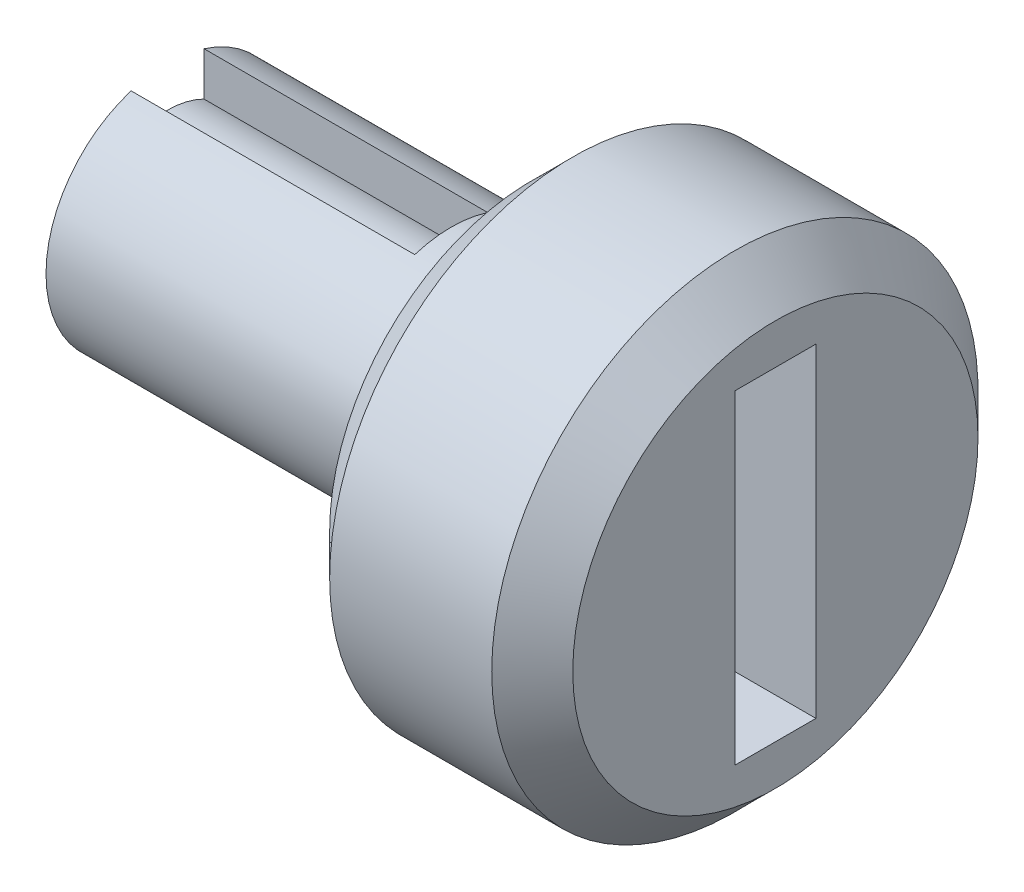
ISO-10303-21;
HEADER;
FILE_DESCRIPTION(('STEP AP214'),'2;1');
FILE_NAME('part.step','',(''),(''),'','','');
FILE_SCHEMA(('AUTOMOTIVE_DESIGN { 1 0 10303 214 1 1 1 1 }'));
ENDSEC;
DATA;
#1=APPLICATION_CONTEXT('core data for automotive mechanical design processes');
#2=APPLICATION_PROTOCOL_DEFINITION('international standard','automotive_design',2000,#1);
#3=PRODUCT_CONTEXT('',#1,'mechanical');
#4=PRODUCT('Part','Part','',(#3));
#5=PRODUCT_RELATED_PRODUCT_CATEGORY('part','',(#4));
#6=PRODUCT_DEFINITION_FORMATION('','',#4);
#7=PRODUCT_DEFINITION_CONTEXT('part definition',#1,'design');
#8=PRODUCT_DEFINITION('design','',#6,#7);
#9=PRODUCT_DEFINITION_SHAPE('','',#8);
#10=(LENGTH_UNIT() NAMED_UNIT(*) SI_UNIT(.MILLI.,.METRE.));
#11=(NAMED_UNIT(*) PLANE_ANGLE_UNIT() SI_UNIT($,.RADIAN.));
#12=(NAMED_UNIT(*) SI_UNIT($,.STERADIAN.) SOLID_ANGLE_UNIT());
#13=UNCERTAINTY_MEASURE_WITH_UNIT(LENGTH_MEASURE(1.E-05),#10,'distance_accuracy_value','');
#14=(GEOMETRIC_REPRESENTATION_CONTEXT(3) GLOBAL_UNCERTAINTY_ASSIGNED_CONTEXT((#13)) GLOBAL_UNIT_ASSIGNED_CONTEXT((#10,
#11,#12)) REPRESENTATION_CONTEXT('',''));
#15=CARTESIAN_POINT('',(0.,0.,0.));
#16=DIRECTION('',(0.,0.,1.));
#17=DIRECTION('',(1.,0.,0.));
#18=AXIS2_PLACEMENT_3D('',#15,#16,#17);
#19=CARTESIAN_POINT('',(0.,0.,0.));
#20=DIRECTION('',(1.,0.,0.));
#21=DIRECTION('',(0.,0.,-1.));
#22=AXIS2_PLACEMENT_3D('',#19,#20,#21);
#23=PLANE('',#22);
#24=CARTESIAN_POINT('',(0.,0.,0.));
#25=DIRECTION('',(-1.,0.,0.));
#26=DIRECTION('',(0.,0.,1.));
#27=AXIS2_PLACEMENT_3D('',#24,#25,#26);
#28=CIRCLE('',#27,1.2);
#29=CARTESIAN_POINT('',(0.,0.,1.2));
#30=VERTEX_POINT('',#29);
#31=EDGE_CURVE('E216',#30,#30,#28,.T.);
#32=ORIENTED_EDGE('',*,*,#31,.F.);
#33=EDGE_LOOP('',(#32));
#34=FACE_BOUND('',#33,.T.);
#35=CARTESIAN_POINT('',(0.,0.,0.));
#36=DIRECTION('',(1.,0.,0.));
#37=DIRECTION('',(0.,0.,1.));
#38=AXIS2_PLACEMENT_3D('',#35,#36,#37);
#39=CIRCLE('',#38,2.);
#40=CARTESIAN_POINT('',(0.,-1.78605710994917,0.9));
#41=VERTEX_POINT('',#40);
#42=CARTESIAN_POINT('',(0.,-1.78605710994917,-0.9));
#43=VERTEX_POINT('',#42);
#44=EDGE_CURVE('E148',#41,#43,#39,.T.);
#45=ORIENTED_EDGE('',*,*,#44,.F.);
#46=DIRECTION('',(0.,1.,0.));
#47=VECTOR('',#46,1.);
#48=CARTESIAN_POINT('',(0.,-1.78605710994917,0.9));
#49=LINE('',#48,#47);
#50=CARTESIAN_POINT('',(0.,-2.86181760425084,0.9));
#51=VERTEX_POINT('',#50);
#52=EDGE_CURVE('E140',#51,#41,#49,.T.);
#53=ORIENTED_EDGE('',*,*,#52,.F.);
#54=CARTESIAN_POINT('',(0.,0.,0.));
#55=DIRECTION('',(-1.,0.,0.));
#56=DIRECTION('',(0.,0.,1.));
#57=AXIS2_PLACEMENT_3D('',#54,#55,#56);
#58=CIRCLE('',#57,3.);
#59=CARTESIAN_POINT('',(0.,2.86181760425084,0.9));
#60=VERTEX_POINT('',#59);
#61=EDGE_CURVE('E57',#51,#60,#58,.T.);
#62=ORIENTED_EDGE('',*,*,#61,.T.);
#63=DIRECTION('',(0.,1.,0.));
#64=VECTOR('',#63,1.);
#65=CARTESIAN_POINT('',(0.,2.86181760425084,0.9));
#66=LINE('',#65,#64);
#67=CARTESIAN_POINT('',(0.,1.78605710994917,0.9));
#68=VERTEX_POINT('',#67);
#69=EDGE_CURVE('E162',#68,#60,#66,.T.);
#70=ORIENTED_EDGE('',*,*,#69,.F.);
#71=CARTESIAN_POINT('',(0.,0.,0.));
#72=DIRECTION('',(1.,0.,0.));
#73=DIRECTION('',(0.,0.,1.));
#74=AXIS2_PLACEMENT_3D('',#71,#72,#73);
#75=CIRCLE('',#74,2.);
#76=CARTESIAN_POINT('',(0.,1.78605710994917,-0.9));
#77=VERTEX_POINT('',#76);
#78=EDGE_CURVE('E165',#77,#68,#75,.T.);
#79=ORIENTED_EDGE('',*,*,#78,.F.);
#80=DIRECTION('',(0.,-1.,0.));
#81=VECTOR('',#80,1.);
#82=CARTESIAN_POINT('',(0.,2.86181760425084,-0.9));
#83=LINE('',#82,#81);
#84=CARTESIAN_POINT('',(0.,2.86181760425084,-0.9));
#85=VERTEX_POINT('',#84);
#86=EDGE_CURVE('E161',#85,#77,#83,.T.);
#87=ORIENTED_EDGE('',*,*,#86,.F.);
#88=CARTESIAN_POINT('',(0.,-2.86181760425084,-0.9));
#89=VERTEX_POINT('',#88);
#90=EDGE_CURVE('E231',#85,#89,#58,.T.);
#91=ORIENTED_EDGE('',*,*,#90,.T.);
#92=DIRECTION('',(0.,-1.,0.));
#93=VECTOR('',#92,1.);
#94=CARTESIAN_POINT('',(0.,-1.78605710994917,-0.9));
#95=LINE('',#94,#93);
#96=EDGE_CURVE('E49',#43,#89,#95,.T.);
#97=ORIENTED_EDGE('',*,*,#96,.F.);
#98=EDGE_LOOP('',(#45,#53,#62,#70,#79,#87,#91,#97));
#99=FACE_BOUND('',#98,.T.);
#100=ADVANCED_FACE('F34',(#34,#99),#23,.F.);
#101=CARTESIAN_POINT('',(0.,0.,0.));
#102=DIRECTION('',(-1.,0.,0.));
#103=DIRECTION('',(0.,0.,1.));
#104=AXIS2_PLACEMENT_3D('',#101,#102,#103);
#105=CYLINDRICAL_SURFACE('',#104,3.);
#106=ORIENTED_EDGE('',*,*,#61,.F.);
#107=DIRECTION('',(-1.,0.,0.));
#108=VECTOR('',#107,1.);
#109=CARTESIAN_POINT('',(11.171095884641,-2.86181760425084,0.9));
#110=LINE('',#109,#108);
#111=CARTESIAN_POINT('',(7.,-2.86181760425084,0.9));
#112=VERTEX_POINT('',#111);
#113=EDGE_CURVE('E154',#112,#51,#110,.T.);
#114=ORIENTED_EDGE('',*,*,#113,.F.);
#115=CARTESIAN_POINT('',(7.,0.,0.));
#116=DIRECTION('',(1.,0.,0.));
#117=DIRECTION('',(0.,0.,-1.));
#118=AXIS2_PLACEMENT_3D('',#115,#116,#117);
#119=CIRCLE('',#118,3.);
#120=CARTESIAN_POINT('',(7.,-2.86181760425084,-0.9));
#121=VERTEX_POINT('',#120);
#122=EDGE_CURVE('E145',#121,#112,#119,.F.);
#123=ORIENTED_EDGE('',*,*,#122,.F.);
#124=DIRECTION('',(-1.,0.,0.));
#125=VECTOR('',#124,1.);
#126=CARTESIAN_POINT('',(11.171095884641,-2.86181760425084,-0.9));
#127=LINE('',#126,#125);
#128=EDGE_CURVE('E155',#121,#89,#127,.T.);
#129=ORIENTED_EDGE('',*,*,#128,.T.);
#130=ORIENTED_EDGE('',*,*,#90,.F.);
#131=DIRECTION('',(-1.,0.,0.));
#132=VECTOR('',#131,1.);
#133=CARTESIAN_POINT('',(11.171095884641,2.86181760425084,-0.9));
#134=LINE('',#133,#132);
#135=CARTESIAN_POINT('',(7.,2.86181760425084,-0.9));
#136=VERTEX_POINT('',#135);
#137=EDGE_CURVE('E176',#136,#85,#134,.T.);
#138=ORIENTED_EDGE('',*,*,#137,.F.);
#139=CARTESIAN_POINT('',(7.,0.,0.));
#140=DIRECTION('',(1.,0.,0.));
#141=DIRECTION('',(0.,0.,-1.));
#142=AXIS2_PLACEMENT_3D('',#139,#140,#141);
#143=CIRCLE('',#142,3.);
#144=CARTESIAN_POINT('',(7.,2.86181760425084,0.9));
#145=VERTEX_POINT('',#144);
#146=EDGE_CURVE('E173',#145,#136,#143,.F.);
#147=ORIENTED_EDGE('',*,*,#146,.F.);
#148=DIRECTION('',(-1.,0.,0.));
#149=VECTOR('',#148,1.);
#150=CARTESIAN_POINT('',(11.171095884641,2.86181760425084,0.9));
#151=LINE('',#150,#149);
#152=EDGE_CURVE('E177',#145,#60,#151,.T.);
#153=ORIENTED_EDGE('',*,*,#152,.T.);
#154=EDGE_LOOP('',(#106,#114,#123,#129,#130,#138,#147,#153));
#155=FACE_BOUND('',#154,.T.);
#156=CARTESIAN_POINT('',(9.,0.,0.));
#157=DIRECTION('',(-1.,0.,0.));
#158=DIRECTION('',(0.,0.,1.));
#159=AXIS2_PLACEMENT_3D('',#156,#157,#158);
#160=CIRCLE('',#159,3.);
#161=CARTESIAN_POINT('',(9.,0.,3.));
#162=VERTEX_POINT('',#161);
#163=EDGE_CURVE('E228',#162,#162,#160,.T.);
#164=ORIENTED_EDGE('',*,*,#163,.T.);
#165=EDGE_LOOP('',(#164));
#166=FACE_BOUND('',#165,.T.);
#167=ADVANCED_FACE('F265',(#155,#166),#105,.T.);
#168=CARTESIAN_POINT('',(9.,0.,-3.));
#169=DIRECTION('',(1.,0.,0.));
#170=DIRECTION('',(0.,0.,-1.));
#171=AXIS2_PLACEMENT_3D('',#168,#169,#170);
#172=PLANE('',#171);
#173=CARTESIAN_POINT('',(9.,0.,0.));
#174=DIRECTION('',(1.,0.,0.));
#175=DIRECTION('',(0.,0.,-1.));
#176=AXIS2_PLACEMENT_3D('',#173,#174,#175);
#177=CIRCLE('',#176,4.99999999999999);
#178=CARTESIAN_POINT('',(9.,0.,-4.99999999999999));
#179=VERTEX_POINT('',#178);
#180=EDGE_CURVE('E13',#179,#179,#177,.F.);
#181=ORIENTED_EDGE('',*,*,#180,.T.);
#182=EDGE_LOOP('',(#181));
#183=FACE_BOUND('',#182,.T.);
#184=ORIENTED_EDGE('',*,*,#163,.F.);
#185=EDGE_LOOP('',(#184));
#186=FACE_BOUND('',#185,.T.);
#187=ADVANCED_FACE('F254',(#183,#186),#172,.F.);
#188=CARTESIAN_POINT('',(0.,0.,0.));
#189=DIRECTION('',(-1.,0.,0.));
#190=DIRECTION('',(0.,0.,1.));
#191=AXIS2_PLACEMENT_3D('',#188,#189,#190);
#192=CYLINDRICAL_SURFACE('',#191,6.);
#193=CARTESIAN_POINT('',(14.,0.,0.));
#194=DIRECTION('',(-1.,0.,0.));
#195=DIRECTION('',(0.,0.,1.));
#196=AXIS2_PLACEMENT_3D('',#193,#194,#195);
#197=CIRCLE('',#196,6.);
#198=CARTESIAN_POINT('',(14.,0.,6.));
#199=VERTEX_POINT('',#198);
#200=EDGE_CURVE('E237',#199,#199,#197,.T.);
#201=ORIENTED_EDGE('',*,*,#200,.T.);
#202=EDGE_LOOP('',(#201));
#203=FACE_BOUND('',#202,.T.);
#204=CARTESIAN_POINT('',(10.,0.,0.));
#205=DIRECTION('',(1.,0.,0.));
#206=DIRECTION('',(0.,0.,-1.));
#207=AXIS2_PLACEMENT_3D('',#204,#205,#206);
#208=CIRCLE('',#207,6.);
#209=CARTESIAN_POINT('',(10.,0.,-6.));
#210=VERTEX_POINT('',#209);
#211=EDGE_CURVE('E234',#210,#210,#208,.T.);
#212=ORIENTED_EDGE('',*,*,#211,.T.);
#213=EDGE_LOOP('',(#212));
#214=FACE_BOUND('',#213,.T.);
#215=ADVANCED_FACE('F251',(#203,#214),#192,.T.);
#216=CARTESIAN_POINT('',(15.,0.,-6.));
#217=DIRECTION('',(-1.,0.,0.));
#218=DIRECTION('',(0.,0.,1.));
#219=AXIS2_PLACEMENT_3D('',#216,#217,#218);
#220=PLANE('',#219);
#221=CARTESIAN_POINT('',(15.,0.,0.));
#222=DIRECTION('',(-1.,0.,0.));
#223=DIRECTION('',(0.,0.,1.));
#224=AXIS2_PLACEMENT_3D('',#221,#222,#223);
#225=CIRCLE('',#224,5.);
#226=CARTESIAN_POINT('',(15.,0.,5.));
#227=VERTEX_POINT('',#226);
#228=EDGE_CURVE('E42',#227,#227,#225,.F.);
#229=ORIENTED_EDGE('',*,*,#228,.T.);
#230=EDGE_LOOP('',(#229));
#231=FACE_BOUND('',#230,.T.);
#232=DIRECTION('',(0.,0.,1.));
#233=VECTOR('',#232,1.);
#234=CARTESIAN_POINT('',(15.,4.,1.));
#235=LINE('',#234,#233);
#236=CARTESIAN_POINT('',(15.,4.,-0.999999999999999));
#237=VERTEX_POINT('',#236);
#238=CARTESIAN_POINT('',(15.,4.,1.));
#239=VERTEX_POINT('',#238);
#240=EDGE_CURVE('E206',#237,#239,#235,.T.);
#241=ORIENTED_EDGE('',*,*,#240,.F.);
#242=DIRECTION('',(0.,1.,0.));
#243=VECTOR('',#242,1.);
#244=CARTESIAN_POINT('',(15.,-4.,-0.999999999999999));
#245=LINE('',#244,#243);
#246=CARTESIAN_POINT('',(15.,-4.,-0.999999999999999));
#247=VERTEX_POINT('',#246);
#248=EDGE_CURVE('E190',#247,#237,#245,.T.);
#249=ORIENTED_EDGE('',*,*,#248,.F.);
#250=DIRECTION('',(0.,0.,-1.));
#251=VECTOR('',#250,1.);
#252=CARTESIAN_POINT('',(15.,-4.,1.));
#253=LINE('',#252,#251);
#254=CARTESIAN_POINT('',(15.,-4.,1.));
#255=VERTEX_POINT('',#254);
#256=EDGE_CURVE('E195',#255,#247,#253,.T.);
#257=ORIENTED_EDGE('',*,*,#256,.F.);
#258=DIRECTION('',(0.,-1.,0.));
#259=VECTOR('',#258,1.);
#260=CARTESIAN_POINT('',(15.,-4.,1.));
#261=LINE('',#260,#259);
#262=EDGE_CURVE('E209',#239,#255,#261,.T.);
#263=ORIENTED_EDGE('',*,*,#262,.F.);
#264=EDGE_LOOP('',(#241,#249,#257,#263));
#265=FACE_BOUND('',#264,.T.);
#266=ADVANCED_FACE('F242',(#231,#265),#220,.F.);
#267=CARTESIAN_POINT('',(9.,0.,-3.));
#268=DIRECTION('',(1.,0.,0.));
#269=DIRECTION('',(0.,0.,-1.));
#270=AXIS2_PLACEMENT_3D('',#267,#268,#269);
#271=PLANE('',#270);
#272=CARTESIAN_POINT('',(9.,0.,0.));
#273=DIRECTION('',(1.,0.,0.));
#274=DIRECTION('',(0.,0.,-1.));
#275=AXIS2_PLACEMENT_3D('',#272,#273,#274);
#276=CIRCLE('',#275,1.2);
#277=CARTESIAN_POINT('',(9.,0.,1.2));
#278=VERTEX_POINT('',#277);
#279=EDGE_CURVE('E225',#278,#278,#276,.F.);
#280=ORIENTED_EDGE('',*,*,#279,.T.);
#281=EDGE_LOOP('',(#280));
#282=FACE_BOUND('',#281,.T.);
#283=ADVANCED_FACE('F280',(#282),#271,.F.);
#284=CARTESIAN_POINT('',(12.3941125496954,0.,0.));
#285=DIRECTION('',(-1.,0.,0.));
#286=DIRECTION('',(0.,0.,1.));
#287=AXIS2_PLACEMENT_3D('',#284,#285,#286);
#288=CYLINDRICAL_SURFACE('',#287,1.2);
#289=CARTESIAN_POINT('',(0.,0.,1.2));
#290=CARTESIAN_POINT('',(0.0937499999999983,0.,1.2));
#291=CARTESIAN_POINT('',(0.187499999999998,0.,1.2));
#292=CARTESIAN_POINT('',(0.374999999999999,0.,1.2));
#293=CARTESIAN_POINT('',(0.468749999999999,0.,1.2));
#294=CARTESIAN_POINT('',(0.656249999999999,0.,1.2));
#295=CARTESIAN_POINT('',(0.749999999999999,0.,1.2));
#296=CARTESIAN_POINT('',(0.937499999999999,0.,1.2));
#297=CARTESIAN_POINT('',(1.03125,0.,1.2));
#298=CARTESIAN_POINT('',(1.21875,0.,1.2));
#299=CARTESIAN_POINT('',(1.3125,0.,1.2));
#300=CARTESIAN_POINT('',(1.5,0.,1.2));
#301=CARTESIAN_POINT('',(1.59375,0.,1.2));
#302=CARTESIAN_POINT('',(1.78125,0.,1.2));
#303=CARTESIAN_POINT('',(1.875,0.,1.2));
#304=CARTESIAN_POINT('',(2.0625,0.,1.2));
#305=CARTESIAN_POINT('',(2.15625,0.,1.2));
#306=CARTESIAN_POINT('',(2.34375,0.,1.2));
#307=CARTESIAN_POINT('',(2.4375,0.,1.2));
#308=CARTESIAN_POINT('',(2.625,0.,1.2));
#309=CARTESIAN_POINT('',(2.71875,0.,1.2));
#310=CARTESIAN_POINT('',(2.90625,0.,1.2));
#311=CARTESIAN_POINT('',(3.,0.,1.2));
#312=CARTESIAN_POINT('',(3.1875,0.,1.2));
#313=CARTESIAN_POINT('',(3.28125,0.,1.2));
#314=CARTESIAN_POINT('',(3.46875,0.,1.2));
#315=CARTESIAN_POINT('',(3.5625,0.,1.2));
#316=CARTESIAN_POINT('',(3.75,0.,1.2));
#317=CARTESIAN_POINT('',(3.84375,0.,1.2));
#318=CARTESIAN_POINT('',(4.03125,0.,1.2));
#319=CARTESIAN_POINT('',(4.125,0.,1.2));
#320=CARTESIAN_POINT('',(4.3125,0.,1.2));
#321=CARTESIAN_POINT('',(4.40625,0.,1.2));
#322=CARTESIAN_POINT('',(4.59375,0.,1.2));
#323=CARTESIAN_POINT('',(4.6875,0.,1.2));
#324=CARTESIAN_POINT('',(4.875,0.,1.2));
#325=CARTESIAN_POINT('',(4.96875,0.,1.2));
#326=CARTESIAN_POINT('',(5.15625,0.,1.2));
#327=CARTESIAN_POINT('',(5.25,0.,1.2));
#328=CARTESIAN_POINT('',(5.4375,0.,1.2));
#329=CARTESIAN_POINT('',(5.53125,0.,1.2));
#330=CARTESIAN_POINT('',(5.71875,0.,1.2));
#331=CARTESIAN_POINT('',(5.8125,0.,1.2));
#332=CARTESIAN_POINT('',(6.,0.,1.2));
#333=CARTESIAN_POINT('',(6.09375,0.,1.2));
#334=CARTESIAN_POINT('',(6.28125,0.,1.2));
#335=CARTESIAN_POINT('',(6.375,0.,1.2));
#336=CARTESIAN_POINT('',(6.5625,0.,1.2));
#337=CARTESIAN_POINT('',(6.65625,0.,1.2));
#338=CARTESIAN_POINT('',(6.84375,0.,1.2));
#339=CARTESIAN_POINT('',(6.9375,0.,1.2));
#340=CARTESIAN_POINT('',(7.125,0.,1.2));
#341=CARTESIAN_POINT('',(7.21875,0.,1.2));
#342=CARTESIAN_POINT('',(7.40625,0.,1.2));
#343=CARTESIAN_POINT('',(7.5,0.,1.2));
#344=CARTESIAN_POINT('',(7.6875,0.,1.2));
#345=CARTESIAN_POINT('',(7.78125,0.,1.2));
#346=CARTESIAN_POINT('',(7.96875,0.,1.2));
#347=CARTESIAN_POINT('',(8.0625,0.,1.2));
#348=CARTESIAN_POINT('',(8.25,0.,1.2));
#349=CARTESIAN_POINT('',(8.34375,0.,1.2));
#350=CARTESIAN_POINT('',(8.53125,0.,1.2));
#351=CARTESIAN_POINT('',(8.625,0.,1.2));
#352=CARTESIAN_POINT('',(8.8125,0.,1.2));
#353=CARTESIAN_POINT('',(8.90625,0.,1.2));
#354=CARTESIAN_POINT('',(9.,0.,1.2));
#355=B_SPLINE_CURVE_WITH_KNOTS('',3,(#289,#290,#291,#292,#293,#294,#295,#296,#297,#298,#299,
#300,#301,#302,#303,#304,#305,#306,#307,#308,#309,#310,#311,#312,#313,#314,#315,#316,#317,#318,
#319,#320,#321,#322,#323,#324,#325,#326,#327,#328,#329,#330,#331,#332,#333,#334,#335,#336,#337,
#338,#339,#340,#341,#342,#343,#344,#345,#346,#347,#348,#349,#350,#351,#352,#353,#354),
.UNSPECIFIED.,.F.,.F.,(4,2,2,2,2,2,2,2,2,2,2,2,2,2,2,2,2,2,2,2,2,2,2,2,2,2,2,2,2,2,2,2,4),(0.,
0.28125,0.5625,0.843750000000001,1.125,1.40625,1.6875,1.96875,2.25,2.53125,2.8125,3.09375,3.375,
3.65625,3.9375,4.21875,4.5,4.78125,5.0625,5.34375,5.625,5.90625,6.1875,6.46875,6.75,7.03125,
7.3125,7.59375,7.875,8.15625,8.4375,8.71875,9.),.UNSPECIFIED.);
#356=EDGE_CURVE('BSEAM283',#30,#278,#355,.T.);
#357=ORIENTED_EDGE('',*,*,#31,.T.);
#358=ORIENTED_EDGE('',*,*,#279,.F.);
#359=ORIENTED_EDGE('',*,*,#356,.T.);
#360=ORIENTED_EDGE('',*,*,#356,.F.);
#361=EDGE_LOOP('',(#357,#359,#358,#360));
#362=FACE_BOUND('',#361,.T.);
#363=ADVANCED_FACE('F283',(#362),#288,.F.);
#364=CARTESIAN_POINT('',(11.,-4.,-0.999999999999999));
#365=DIRECTION('',(0.,0.,-1.));
#366=DIRECTION('',(-1.,0.,0.));
#367=AXIS2_PLACEMENT_3D('',#364,#365,#366);
#368=PLANE('',#367);
#369=ORIENTED_EDGE('',*,*,#248,.T.);
#370=DIRECTION('',(1.,0.,0.));
#371=VECTOR('',#370,1.);
#372=CARTESIAN_POINT('',(11.,4.,-0.999999999999999));
#373=LINE('',#372,#371);
#374=CARTESIAN_POINT('',(11.,4.,-0.999999999999999));
#375=VERTEX_POINT('',#374);
#376=EDGE_CURVE('E204',#375,#237,#373,.T.);
#377=ORIENTED_EDGE('',*,*,#376,.F.);
#378=DIRECTION('',(0.,1.,0.));
#379=VECTOR('',#378,1.);
#380=CARTESIAN_POINT('',(11.,-4.,-0.999999999999999));
#381=LINE('',#380,#379);
#382=CARTESIAN_POINT('',(11.,-4.,-0.999999999999999));
#383=VERTEX_POINT('',#382);
#384=EDGE_CURVE('E191',#383,#375,#381,.T.);
#385=ORIENTED_EDGE('',*,*,#384,.F.);
#386=DIRECTION('',(1.,0.,0.));
#387=VECTOR('',#386,1.);
#388=CARTESIAN_POINT('',(11.,-4.,-0.999999999999999));
#389=LINE('',#388,#387);
#390=EDGE_CURVE('E214',#383,#247,#389,.T.);
#391=ORIENTED_EDGE('',*,*,#390,.T.);
#392=EDGE_LOOP('',(#369,#377,#385,#391));
#393=FACE_BOUND('',#392,.T.);
#394=ADVANCED_FACE('F287',(#393),#368,.F.);
#395=CARTESIAN_POINT('',(11.,-4.,1.));
#396=DIRECTION('',(0.,-1.,0.));
#397=DIRECTION('',(0.,0.,-1.));
#398=AXIS2_PLACEMENT_3D('',#395,#396,#397);
#399=PLANE('',#398);
#400=ORIENTED_EDGE('',*,*,#256,.T.);
#401=ORIENTED_EDGE('',*,*,#390,.F.);
#402=DIRECTION('',(0.,0.,-1.));
#403=VECTOR('',#402,1.);
#404=CARTESIAN_POINT('',(11.,-4.,1.));
#405=LINE('',#404,#403);
#406=CARTESIAN_POINT('',(11.,-4.,1.));
#407=VERTEX_POINT('',#406);
#408=EDGE_CURVE('E201',#407,#383,#405,.T.);
#409=ORIENTED_EDGE('',*,*,#408,.F.);
#410=DIRECTION('',(1.,0.,0.));
#411=VECTOR('',#410,1.);
#412=CARTESIAN_POINT('',(11.,-4.,1.));
#413=LINE('',#412,#411);
#414=EDGE_CURVE('E217',#407,#255,#413,.T.);
#415=ORIENTED_EDGE('',*,*,#414,.T.);
#416=EDGE_LOOP('',(#400,#401,#409,#415));
#417=FACE_BOUND('',#416,.T.);
#418=ADVANCED_FACE('F291',(#417),#399,.F.);
#419=CARTESIAN_POINT('',(11.,-4.,1.));
#420=DIRECTION('',(0.,0.,1.));
#421=DIRECTION('',(1.,0.,0.));
#422=AXIS2_PLACEMENT_3D('',#419,#420,#421);
#423=PLANE('',#422);
#424=ORIENTED_EDGE('',*,*,#262,.T.);
#425=ORIENTED_EDGE('',*,*,#414,.F.);
#426=DIRECTION('',(0.,-1.,0.));
#427=VECTOR('',#426,1.);
#428=CARTESIAN_POINT('',(11.,-4.,1.));
#429=LINE('',#428,#427);
#430=CARTESIAN_POINT('',(11.,4.,1.));
#431=VERTEX_POINT('',#430);
#432=EDGE_CURVE('E198',#431,#407,#429,.T.);
#433=ORIENTED_EDGE('',*,*,#432,.F.);
#434=DIRECTION('',(1.,0.,0.));
#435=VECTOR('',#434,1.);
#436=CARTESIAN_POINT('',(11.,4.,1.));
#437=LINE('',#436,#435);
#438=EDGE_CURVE('E219',#431,#239,#437,.T.);
#439=ORIENTED_EDGE('',*,*,#438,.T.);
#440=EDGE_LOOP('',(#424,#425,#433,#439));
#441=FACE_BOUND('',#440,.T.);
#442=ADVANCED_FACE('F296',(#441),#423,.F.);
#443=CARTESIAN_POINT('',(11.,4.,1.));
#444=DIRECTION('',(0.,1.,0.));
#445=DIRECTION('',(0.,0.,1.));
#446=AXIS2_PLACEMENT_3D('',#443,#444,#445);
#447=PLANE('',#446);
#448=ORIENTED_EDGE('',*,*,#240,.T.);
#449=ORIENTED_EDGE('',*,*,#438,.F.);
#450=DIRECTION('',(0.,0.,1.));
#451=VECTOR('',#450,1.);
#452=CARTESIAN_POINT('',(11.,4.,1.));
#453=LINE('',#452,#451);
#454=EDGE_CURVE('E194',#375,#431,#453,.T.);
#455=ORIENTED_EDGE('',*,*,#454,.F.);
#456=ORIENTED_EDGE('',*,*,#376,.T.);
#457=EDGE_LOOP('',(#448,#449,#455,#456));
#458=FACE_BOUND('',#457,.T.);
#459=ADVANCED_FACE('F293',(#458),#447,.F.);
#460=CARTESIAN_POINT('',(11.,4.,-0.999999999999999));
#461=DIRECTION('',(-1.,0.,0.));
#462=DIRECTION('',(0.,0.,1.));
#463=AXIS2_PLACEMENT_3D('',#460,#461,#462);
#464=PLANE('',#463);
#465=ORIENTED_EDGE('',*,*,#384,.T.);
#466=ORIENTED_EDGE('',*,*,#454,.T.);
#467=ORIENTED_EDGE('',*,*,#432,.T.);
#468=ORIENTED_EDGE('',*,*,#408,.T.);
#469=EDGE_LOOP('',(#465,#466,#467,#468));
#470=FACE_BOUND('',#469,.T.);
#471=ADVANCED_FACE('F248',(#470),#464,.F.);
#472=CARTESIAN_POINT('',(14.,0.,0.));
#473=DIRECTION('',(-1.,0.,0.));
#474=DIRECTION('',(0.,0.,1.));
#475=AXIS2_PLACEMENT_3D('',#472,#473,#474);
#476=CONICAL_SURFACE('',#475,6.,0.78539816339745);
#477=ORIENTED_EDGE('',*,*,#228,.F.);
#478=EDGE_LOOP('',(#477));
#479=FACE_BOUND('',#478,.T.);
#480=ORIENTED_EDGE('',*,*,#200,.F.);
#481=EDGE_LOOP('',(#480));
#482=FACE_BOUND('',#481,.T.);
#483=ADVANCED_FACE('F245',(#479,#482),#476,.T.);
#484=CARTESIAN_POINT('',(9.,0.,0.));
#485=DIRECTION('',(1.,0.,0.));
#486=DIRECTION('',(0.,0.,-1.));
#487=AXIS2_PLACEMENT_3D('',#484,#485,#486);
#488=CONICAL_SURFACE('',#487,4.99999999999999,0.785398163397448);
#489=ORIENTED_EDGE('',*,*,#211,.F.);
#490=EDGE_LOOP('',(#489));
#491=FACE_BOUND('',#490,.T.);
#492=ORIENTED_EDGE('',*,*,#180,.F.);
#493=EDGE_LOOP('',(#492));
#494=FACE_BOUND('',#493,.T.);
#495=ADVANCED_FACE('F36',(#491,#494),#488,.T.);
#496=CARTESIAN_POINT('',(7.,0.,-3.));
#497=DIRECTION('',(1.,0.,0.));
#498=DIRECTION('',(0.,0.,-1.));
#499=AXIS2_PLACEMENT_3D('',#496,#497,#498);
#500=PLANE('',#499);
#501=ORIENTED_EDGE('',*,*,#146,.T.);
#502=DIRECTION('',(0.,-1.,0.));
#503=VECTOR('',#502,1.);
#504=CARTESIAN_POINT('',(7.,2.86181760425084,-0.9));
#505=LINE('',#504,#503);
#506=CARTESIAN_POINT('',(7.,1.78605710994917,-0.9));
#507=VERTEX_POINT('',#506);
#508=EDGE_CURVE('E164',#136,#507,#505,.T.);
#509=ORIENTED_EDGE('',*,*,#508,.T.);
#510=CARTESIAN_POINT('',(7.,0.,0.));
#511=DIRECTION('',(1.,0.,0.));
#512=DIRECTION('',(0.,0.,-1.));
#513=AXIS2_PLACEMENT_3D('',#510,#511,#512);
#514=CIRCLE('',#513,2.);
#515=CARTESIAN_POINT('',(7.,1.78605710994917,0.9));
#516=VERTEX_POINT('',#515);
#517=EDGE_CURVE('E182',#507,#516,#514,.T.);
#518=ORIENTED_EDGE('',*,*,#517,.T.);
#519=DIRECTION('',(0.,1.,0.));
#520=VECTOR('',#519,1.);
#521=CARTESIAN_POINT('',(7.,2.86181760425084,0.9));
#522=LINE('',#521,#520);
#523=EDGE_CURVE('E178',#516,#145,#522,.T.);
#524=ORIENTED_EDGE('',*,*,#523,.T.);
#525=EDGE_LOOP('',(#501,#509,#518,#524));
#526=FACE_BOUND('',#525,.T.);
#527=ADVANCED_FACE('F260',(#526),#500,.F.);
#528=CARTESIAN_POINT('',(11.171095884641,2.86181760425084,-0.9));
#529=DIRECTION('',(0.,0.,-1.));
#530=DIRECTION('',(-1.,0.,0.));
#531=AXIS2_PLACEMENT_3D('',#528,#529,#530);
#532=PLANE('',#531);
#533=ORIENTED_EDGE('',*,*,#137,.T.);
#534=ORIENTED_EDGE('',*,*,#86,.T.);
#535=DIRECTION('',(-1.,0.,0.));
#536=VECTOR('',#535,1.);
#537=CARTESIAN_POINT('',(11.171095884641,1.78605710994917,-0.9));
#538=LINE('',#537,#536);
#539=EDGE_CURVE('E172',#507,#77,#538,.T.);
#540=ORIENTED_EDGE('',*,*,#539,.F.);
#541=ORIENTED_EDGE('',*,*,#508,.F.);
#542=EDGE_LOOP('',(#533,#534,#540,#541));
#543=FACE_BOUND('',#542,.T.);
#544=ADVANCED_FACE('F309',(#543),#532,.F.);
#545=CARTESIAN_POINT('',(11.171095884641,0.,0.));
#546=DIRECTION('',(-1.,0.,0.));
#547=DIRECTION('',(0.,0.,1.));
#548=AXIS2_PLACEMENT_3D('',#545,#546,#547);
#549=CYLINDRICAL_SURFACE('',#548,2.);
#550=ORIENTED_EDGE('',*,*,#539,.T.);
#551=ORIENTED_EDGE('',*,*,#78,.T.);
#552=DIRECTION('',(-1.,0.,0.));
#553=VECTOR('',#552,1.);
#554=CARTESIAN_POINT('',(11.171095884641,1.78605710994917,0.9));
#555=LINE('',#554,#553);
#556=EDGE_CURVE('E181',#516,#68,#555,.T.);
#557=ORIENTED_EDGE('',*,*,#556,.F.);
#558=ORIENTED_EDGE('',*,*,#517,.F.);
#559=EDGE_LOOP('',(#550,#551,#557,#558));
#560=FACE_BOUND('',#559,.T.);
#561=ADVANCED_FACE('F313',(#560),#549,.T.);
#562=CARTESIAN_POINT('',(11.171095884641,2.86181760425084,0.9));
#563=DIRECTION('',(0.,0.,1.));
#564=DIRECTION('',(1.,0.,0.));
#565=AXIS2_PLACEMENT_3D('',#562,#563,#564);
#566=PLANE('',#565);
#567=ORIENTED_EDGE('',*,*,#556,.T.);
#568=ORIENTED_EDGE('',*,*,#69,.T.);
#569=ORIENTED_EDGE('',*,*,#152,.F.);
#570=ORIENTED_EDGE('',*,*,#523,.F.);
#571=EDGE_LOOP('',(#567,#568,#569,#570));
#572=FACE_BOUND('',#571,.T.);
#573=ADVANCED_FACE('F317',(#572),#566,.F.);
#574=CARTESIAN_POINT('',(7.,0.,-3.));
#575=DIRECTION('',(1.,0.,0.));
#576=DIRECTION('',(0.,0.,-1.));
#577=AXIS2_PLACEMENT_3D('',#574,#575,#576);
#578=PLANE('',#577);
#579=ORIENTED_EDGE('',*,*,#122,.T.);
#580=DIRECTION('',(0.,1.,0.));
#581=VECTOR('',#580,1.);
#582=CARTESIAN_POINT('',(7.,-1.78605710994917,0.9));
#583=LINE('',#582,#581);
#584=CARTESIAN_POINT('',(7.,-1.78605710994917,0.9));
#585=VERTEX_POINT('',#584);
#586=EDGE_CURVE('E138',#112,#585,#583,.T.);
#587=ORIENTED_EDGE('',*,*,#586,.T.);
#588=CARTESIAN_POINT('',(7.,0.,0.));
#589=DIRECTION('',(1.,0.,0.));
#590=DIRECTION('',(0.,0.,-1.));
#591=AXIS2_PLACEMENT_3D('',#588,#589,#590);
#592=CIRCLE('',#591,2.);
#593=CARTESIAN_POINT('',(7.,-1.78605710994917,-0.9));
#594=VERTEX_POINT('',#593);
#595=EDGE_CURVE('E125',#585,#594,#592,.T.);
#596=ORIENTED_EDGE('',*,*,#595,.T.);
#597=DIRECTION('',(0.,-1.,0.));
#598=VECTOR('',#597,1.);
#599=CARTESIAN_POINT('',(7.,-1.78605710994917,-0.9));
#600=LINE('',#599,#598);
#601=EDGE_CURVE('E156',#594,#121,#600,.T.);
#602=ORIENTED_EDGE('',*,*,#601,.T.);
#603=EDGE_LOOP('',(#579,#587,#596,#602));
#604=FACE_BOUND('',#603,.T.);
#605=ADVANCED_FACE('F143',(#604),#578,.F.);
#606=CARTESIAN_POINT('',(11.171095884641,-1.78605710994917,0.9));
#607=DIRECTION('',(0.,0.,1.));
#608=DIRECTION('',(0.,-1.,0.));
#609=AXIS2_PLACEMENT_3D('',#606,#607,#608);
#610=PLANE('',#609);
#611=ORIENTED_EDGE('',*,*,#113,.T.);
#612=ORIENTED_EDGE('',*,*,#52,.T.);
#613=DIRECTION('',(-1.,0.,0.));
#614=VECTOR('',#613,1.);
#615=CARTESIAN_POINT('',(11.171095884641,-1.78605710994917,0.9));
#616=LINE('',#615,#614);
#617=EDGE_CURVE('E129',#585,#41,#616,.T.);
#618=ORIENTED_EDGE('',*,*,#617,.F.);
#619=ORIENTED_EDGE('',*,*,#586,.F.);
#620=EDGE_LOOP('',(#611,#612,#618,#619));
#621=FACE_BOUND('',#620,.T.);
#622=ADVANCED_FACE('F137',(#621),#610,.F.);
#623=CARTESIAN_POINT('',(11.171095884641,0.,0.));
#624=DIRECTION('',(-1.,0.,0.));
#625=DIRECTION('',(0.,0.,1.));
#626=AXIS2_PLACEMENT_3D('',#623,#624,#625);
#627=CYLINDRICAL_SURFACE('',#626,2.);
#628=ORIENTED_EDGE('',*,*,#617,.T.);
#629=ORIENTED_EDGE('',*,*,#44,.T.);
#630=DIRECTION('',(-1.,0.,0.));
#631=VECTOR('',#630,1.);
#632=CARTESIAN_POINT('',(11.171095884641,-1.78605710994917,-0.9));
#633=LINE('',#632,#631);
#634=EDGE_CURVE('E131',#594,#43,#633,.T.);
#635=ORIENTED_EDGE('',*,*,#634,.F.);
#636=ORIENTED_EDGE('',*,*,#595,.F.);
#637=EDGE_LOOP('',(#628,#629,#635,#636));
#638=FACE_BOUND('',#637,.T.);
#639=ADVANCED_FACE('F127',(#638),#627,.T.);
#640=CARTESIAN_POINT('',(11.171095884641,-1.78605710994917,-0.9));
#641=DIRECTION('',(0.,0.,-1.));
#642=DIRECTION('',(-1.,0.,0.));
#643=AXIS2_PLACEMENT_3D('',#640,#641,#642);
#644=PLANE('',#643);
#645=ORIENTED_EDGE('',*,*,#634,.T.);
#646=ORIENTED_EDGE('',*,*,#96,.T.);
#647=ORIENTED_EDGE('',*,*,#128,.F.);
#648=ORIENTED_EDGE('',*,*,#601,.F.);
#649=EDGE_LOOP('',(#645,#646,#647,#648));
#650=FACE_BOUND('',#649,.T.);
#651=ADVANCED_FACE('F328',(#650),#644,.F.);
#652=CLOSED_SHELL('',(#100,#167,#187,#215,#266,#283,#363,#394,#418,#442,#459,#471,#483,#495,
#527,#544,#561,#573,#605,#622,#639,#651));
#653=MANIFOLD_SOLID_BREP('B2',#652);
#654=ADVANCED_BREP_SHAPE_REPRESENTATION('',(#18,#653),#14);
#655=SHAPE_DEFINITION_REPRESENTATION(#9,#654);
ENDSEC;
END-ISO-10303-21;
